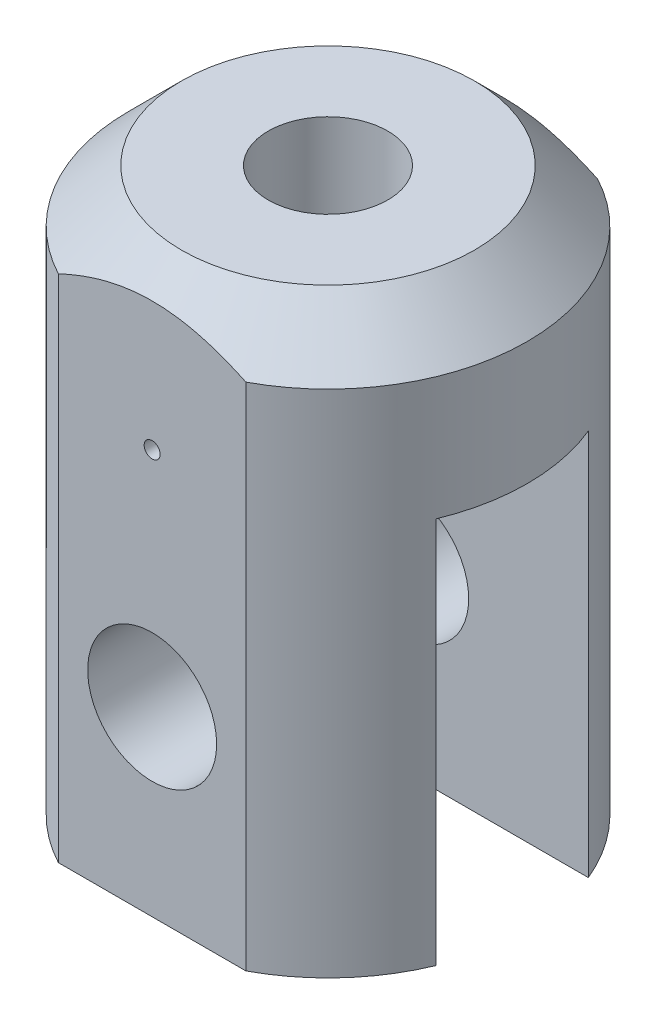
ISO-10303-21;
HEADER;
FILE_DESCRIPTION(('STEP AP214'),'2;1');
FILE_NAME('part.step','',(''),(''),'','','');
FILE_SCHEMA(('AUTOMOTIVE_DESIGN { 1 0 10303 214 1 1 1 1 }'));
ENDSEC;
DATA;
#1=APPLICATION_CONTEXT('core data for automotive mechanical design processes');
#2=APPLICATION_PROTOCOL_DEFINITION('international standard','automotive_design',2000,#1);
#3=PRODUCT_CONTEXT('',#1,'mechanical');
#4=PRODUCT('Part','Part','',(#3));
#5=PRODUCT_RELATED_PRODUCT_CATEGORY('part','',(#4));
#6=PRODUCT_DEFINITION_FORMATION('','',#4);
#7=PRODUCT_DEFINITION_CONTEXT('part definition',#1,'design');
#8=PRODUCT_DEFINITION('design','',#6,#7);
#9=PRODUCT_DEFINITION_SHAPE('','',#8);
#10=(LENGTH_UNIT() NAMED_UNIT(*) SI_UNIT(.MILLI.,.METRE.));
#11=(NAMED_UNIT(*) PLANE_ANGLE_UNIT() SI_UNIT($,.RADIAN.));
#12=(NAMED_UNIT(*) SI_UNIT($,.STERADIAN.) SOLID_ANGLE_UNIT());
#13=UNCERTAINTY_MEASURE_WITH_UNIT(LENGTH_MEASURE(1.E-05),#10,'distance_accuracy_value','');
#14=(GEOMETRIC_REPRESENTATION_CONTEXT(3) GLOBAL_UNCERTAINTY_ASSIGNED_CONTEXT((#13)) GLOBAL_UNIT_ASSIGNED_CONTEXT((#10,
#11,#12)) REPRESENTATION_CONTEXT('',''));
#15=CARTESIAN_POINT('',(0.,0.,0.));
#16=DIRECTION('',(0.,0.,1.));
#17=DIRECTION('',(1.,0.,0.));
#18=AXIS2_PLACEMENT_3D('',#15,#16,#17);
#19=CARTESIAN_POINT('',(0.,-240.,0.));
#20=DIRECTION('',(0.,1.,0.));
#21=DIRECTION('',(0.,0.,1.));
#22=AXIS2_PLACEMENT_3D('',#19,#20,#21);
#23=PLANE('',#22);
#24=CARTESIAN_POINT('',(0.,-240.,0.));
#25=DIRECTION('',(0.,1.,0.));
#26=DIRECTION('',(0.,0.,1.));
#27=AXIS2_PLACEMENT_3D('',#24,#25,#26);
#28=CIRCLE('',#27,85.);
#29=CARTESIAN_POINT('',(-78.541390362025,-240.,32.5));
#30=VERTEX_POINT('',#29);
#31=CARTESIAN_POINT('',(-40.,-240.,75.));
#32=VERTEX_POINT('',#31);
#33=EDGE_CURVE('E124',#30,#32,#28,.T.);
#34=ORIENTED_EDGE('',*,*,#33,.F.);
#35=DIRECTION('',(1.,0.,0.));
#36=VECTOR('',#35,1.);
#37=CARTESIAN_POINT('',(0.,-240.,32.5));
#38=LINE('',#37,#36);
#39=CARTESIAN_POINT('',(78.5413903620251,-240.,32.5));
#40=VERTEX_POINT('',#39);
#41=EDGE_CURVE('E43',#30,#40,#38,.T.);
#42=ORIENTED_EDGE('',*,*,#41,.T.);
#43=CARTESIAN_POINT('',(40.,-240.,75.));
#44=VERTEX_POINT('',#43);
#45=EDGE_CURVE('E121',#44,#40,#28,.T.);
#46=ORIENTED_EDGE('',*,*,#45,.F.);
#47=DIRECTION('',(1.,0.,0.));
#48=VECTOR('',#47,1.);
#49=CARTESIAN_POINT('',(-79.413150279292,-240.,75.));
#50=LINE('',#49,#48);
#51=EDGE_CURVE('E160',#32,#44,#50,.T.);
#52=ORIENTED_EDGE('',*,*,#51,.F.);
#53=EDGE_LOOP('',(#34,#42,#46,#52));
#54=FACE_BOUND('',#53,.T.);
#55=ADVANCED_FACE('F34',(#54),#23,.F.);
#56=CARTESIAN_POINT('',(0.,-240.,0.));
#57=DIRECTION('',(0.,1.,0.));
#58=DIRECTION('',(0.,0.,1.));
#59=AXIS2_PLACEMENT_3D('',#56,#57,#58);
#60=CYLINDRICAL_SURFACE('',#59,85.);
#61=DIRECTION('',(0.,1.,0.));
#62=VECTOR('',#61,1.);
#63=CARTESIAN_POINT('',(78.5413903620251,-240.,32.5));
#64=LINE('',#63,#62);
#65=CARTESIAN_POINT('',(78.5413903620251,-75.,32.5));
#66=VERTEX_POINT('',#65);
#67=EDGE_CURVE('E203',#66,#40,#64,.F.);
#68=ORIENTED_EDGE('',*,*,#67,.F.);
#69=CARTESIAN_POINT('',(0.,-75.,0.));
#70=DIRECTION('',(0.,-1.,0.));
#71=DIRECTION('',(0.,0.,-1.));
#72=AXIS2_PLACEMENT_3D('',#69,#70,#71);
#73=CIRCLE('',#72,85.);
#74=CARTESIAN_POINT('',(78.5413903620251,-75.,-32.5));
#75=VERTEX_POINT('',#74);
#76=EDGE_CURVE('E115',#66,#75,#73,.F.);
#77=ORIENTED_EDGE('',*,*,#76,.T.);
#78=DIRECTION('',(0.,1.,0.));
#79=VECTOR('',#78,1.);
#80=CARTESIAN_POINT('',(78.5413903620251,-240.,-32.5));
#81=LINE('',#80,#79);
#82=CARTESIAN_POINT('',(78.5413903620251,-240.,-32.5));
#83=VERTEX_POINT('',#82);
#84=EDGE_CURVE('E101',#83,#75,#81,.T.);
#85=ORIENTED_EDGE('',*,*,#84,.F.);
#86=CARTESIAN_POINT('',(40.,-240.,-75.));
#87=VERTEX_POINT('',#86);
#88=EDGE_CURVE('E113',#83,#87,#28,.T.);
#89=ORIENTED_EDGE('',*,*,#88,.T.);
#90=DIRECTION('',(0.,1.,0.));
#91=VECTOR('',#90,1.);
#92=CARTESIAN_POINT('',(40.,-240.,-75.));
#93=LINE('',#92,#91);
#94=CARTESIAN_POINT('',(40.,-22.5,-75.));
#95=VERTEX_POINT('',#94);
#96=EDGE_CURVE('E122',#95,#87,#93,.F.);
#97=ORIENTED_EDGE('',*,*,#96,.F.);
#98=CARTESIAN_POINT('',(0.,-22.5,0.));
#99=DIRECTION('',(0.,-1.,0.));
#100=DIRECTION('',(0.,0.,-1.));
#101=AXIS2_PLACEMENT_3D('',#98,#99,#100);
#102=CIRCLE('',#101,85.);
#103=CARTESIAN_POINT('',(40.,-22.5,75.));
#104=VERTEX_POINT('',#103);
#105=EDGE_CURVE('E202',#95,#104,#102,.T.);
#106=ORIENTED_EDGE('',*,*,#105,.T.);
#107=DIRECTION('',(0.,1.,0.));
#108=VECTOR('',#107,1.);
#109=CARTESIAN_POINT('',(40.,-240.,75.));
#110=LINE('',#109,#108);
#111=EDGE_CURVE('E196',#104,#44,#110,.F.);
#112=ORIENTED_EDGE('',*,*,#111,.T.);
#113=ORIENTED_EDGE('',*,*,#45,.T.);
#114=EDGE_LOOP('',(#68,#77,#85,#89,#97,#106,#112,#113));
#115=FACE_BOUND('',#114,.T.);
#116=ADVANCED_FACE('F36',(#115),#60,.T.);
#117=DIRECTION('',(0.,1.,0.));
#118=VECTOR('',#117,1.);
#119=CARTESIAN_POINT('',(-78.5413903620251,-240.,32.5));
#120=LINE('',#119,#118);
#121=CARTESIAN_POINT('',(-78.5413903620251,-75.,32.5));
#122=VERTEX_POINT('',#121);
#123=EDGE_CURVE('E116',#30,#122,#120,.T.);
#124=ORIENTED_EDGE('',*,*,#123,.F.);
#125=ORIENTED_EDGE('',*,*,#33,.T.);
#126=DIRECTION('',(0.,1.,0.));
#127=VECTOR('',#126,1.);
#128=CARTESIAN_POINT('',(-40.,-240.,75.));
#129=LINE('',#128,#127);
#130=CARTESIAN_POINT('',(-40.,-22.5,75.));
#131=VERTEX_POINT('',#130);
#132=EDGE_CURVE('E193',#32,#131,#129,.T.);
#133=ORIENTED_EDGE('',*,*,#132,.T.);
#134=CARTESIAN_POINT('',(-40.,-22.5,-75.));
#135=VERTEX_POINT('',#134);
#136=EDGE_CURVE('E58',#131,#135,#102,.T.);
#137=ORIENTED_EDGE('',*,*,#136,.T.);
#138=DIRECTION('',(0.,1.,0.));
#139=VECTOR('',#138,1.);
#140=CARTESIAN_POINT('',(-40.,-240.,-75.));
#141=LINE('',#140,#139);
#142=CARTESIAN_POINT('',(-40.,-240.,-75.));
#143=VERTEX_POINT('',#142);
#144=EDGE_CURVE('E127',#143,#135,#141,.T.);
#145=ORIENTED_EDGE('',*,*,#144,.F.);
#146=CARTESIAN_POINT('',(-78.5413903620251,-240.,-32.5));
#147=VERTEX_POINT('',#146);
#148=EDGE_CURVE('E125',#143,#147,#28,.T.);
#149=ORIENTED_EDGE('',*,*,#148,.T.);
#150=DIRECTION('',(0.,1.,0.));
#151=VECTOR('',#150,1.);
#152=CARTESIAN_POINT('',(-78.5413903620251,-240.,-32.5));
#153=LINE('',#152,#151);
#154=CARTESIAN_POINT('',(-78.5413903620251,-75.,-32.5));
#155=VERTEX_POINT('',#154);
#156=EDGE_CURVE('E50',#155,#147,#153,.F.);
#157=ORIENTED_EDGE('',*,*,#156,.F.);
#158=CARTESIAN_POINT('',(0.,-75.,0.));
#159=DIRECTION('',(0.,-1.,0.));
#160=DIRECTION('',(0.,0.,-1.));
#161=AXIS2_PLACEMENT_3D('',#158,#159,#160);
#162=CIRCLE('',#161,85.);
#163=EDGE_CURVE('E11',#155,#122,#162,.F.);
#164=ORIENTED_EDGE('',*,*,#163,.T.);
#165=EDGE_LOOP('',(#124,#125,#133,#137,#145,#149,#157,#164));
#166=FACE_BOUND('',#165,.T.);
#167=ADVANCED_FACE('F170',(#166),#60,.T.);
#168=ORIENTED_EDGE('',*,*,#88,.F.);
#169=DIRECTION('',(-1.,0.,0.));
#170=VECTOR('',#169,1.);
#171=CARTESIAN_POINT('',(0.,-240.,-32.5));
#172=LINE('',#171,#170);
#173=EDGE_CURVE('E98',#83,#147,#172,.T.);
#174=ORIENTED_EDGE('',*,*,#173,.T.);
#175=ORIENTED_EDGE('',*,*,#148,.F.);
#176=DIRECTION('',(1.,0.,0.));
#177=VECTOR('',#176,1.);
#178=CARTESIAN_POINT('',(-79.413150279292,-240.,-75.));
#179=LINE('',#178,#177);
#180=EDGE_CURVE('E120',#143,#87,#179,.T.);
#181=ORIENTED_EDGE('',*,*,#180,.T.);
#182=EDGE_LOOP('',(#168,#174,#175,#181));
#183=FACE_BOUND('',#182,.T.);
#184=ADVANCED_FACE('F119',(#183),#23,.F.);
#185=CARTESIAN_POINT('',(-79.413150279292,-240.,-75.));
#186=DIRECTION('',(0.,0.,1.));
#187=DIRECTION('',(1.,0.,0.));
#188=AXIS2_PLACEMENT_3D('',#185,#186,#187);
#189=PLANE('',#188);
#190=CARTESIAN_POINT('',(0.,-162.5,-75.));
#191=DIRECTION('',(0.,0.,1.));
#192=DIRECTION('',(1.,0.,0.));
#193=AXIS2_PLACEMENT_3D('',#190,#191,#192);
#194=CIRCLE('',#193,27.5);
#195=CARTESIAN_POINT('',(27.5,-162.5,-75.));
#196=VERTEX_POINT('',#195);
#197=EDGE_CURVE('E220',#196,#196,#194,.T.);
#198=ORIENTED_EDGE('',*,*,#197,.T.);
#199=EDGE_LOOP('',(#198));
#200=FACE_BOUND('',#199,.T.);
#201=ORIENTED_EDGE('',*,*,#144,.T.);
#202=CARTESIAN_POINT('',(-80.0965565096228,-47.229022435722,-75.));
#203=CARTESIAN_POINT('',(-79.1076807722083,-46.5072125290357,-75.));
#204=CARTESIAN_POINT('',(-78.1158416018095,-45.7894481177992,-75.));
#205=CARTESIAN_POINT('',(-76.1257846585171,-44.3627753691444,-75.));
#206=CARTESIAN_POINT('',(-75.127566753531,-43.6538672160278,-75.));
#207=CARTESIAN_POINT('',(-73.1240710175857,-42.2455118772379,-75.));
#208=CARTESIAN_POINT('',(-72.1187913518815,-41.5460672997208,-75.));
#209=CARTESIAN_POINT('',(-70.1009726581121,-40.1577335242058,-75.));
#210=CARTESIAN_POINT('',(-69.0884336651553,-39.4688442752096,-75.));
#211=CARTESIAN_POINT('',(-67.0477730628265,-38.0973590972641,-75.));
#212=CARTESIAN_POINT('',(-66.019591500738,-37.4148523081759,-75.));
#213=CARTESIAN_POINT('',(-63.9548011707982,-36.0627100265484,-75.));
#214=CARTESIAN_POINT('',(-62.9181924490843,-35.3930744636084,-75.));
#215=CARTESIAN_POINT('',(-60.8360191349141,-34.0679881792657,-75.));
#216=CARTESIAN_POINT('',(-59.7904550317895,-33.4125366896449,-75.));
#217=CARTESIAN_POINT('',(-57.6897259572525,-32.1172324416316,-75.));
#218=CARTESIAN_POINT('',(-56.6345611569549,-31.4773794059701,-75.));
#219=CARTESIAN_POINT('',(-54.4634591626763,-30.1847979775503,-75.));
#220=CARTESIAN_POINT('',(-53.3470217279639,-29.532908618892,-75.));
#221=CARTESIAN_POINT('',(-51.1021438875075,-28.2500998850919,-75.));
#222=CARTESIAN_POINT('',(-49.9737034446527,-27.6191805748103,-75.));
#223=CARTESIAN_POINT('',(-47.7038845577264,-26.3805713741219,-75.));
#224=CARTESIAN_POINT('',(-46.5625040365004,-25.7728852835957,-75.));
#225=CARTESIAN_POINT('',(-44.2662691495148,-24.5835119150129,-75.));
#226=CARTESIAN_POINT('',(-43.1114148664573,-24.0018244774821,-75.));
#227=CARTESIAN_POINT('',(-40.7909699944915,-22.8690868947769,-75.));
#228=CARTESIAN_POINT('',(-39.6254215159099,-22.3179508312541,-75.));
#229=CARTESIAN_POINT('',(-37.2797239529272,-21.2477675090494,-75.));
#230=CARTESIAN_POINT('',(-36.0995745331904,-20.7287209890068,-75.));
#231=CARTESIAN_POINT('',(-32.5372440993667,-19.2253778409192,-75.));
#232=CARTESIAN_POINT('',(-30.1319723460605,-18.2942798359704,-75.));
#233=CARTESIAN_POINT('',(-26.5326965036466,-17.0474215584432,-75.));
#234=CARTESIAN_POINT('',(-25.3617932176856,-16.6641600323161,-75.));
#235=CARTESIAN_POINT('',(-23.0065261873304,-15.9413421624267,-75.));
#236=CARTESIAN_POINT('',(-21.8221629965068,-15.601784028287,-75.));
#237=CARTESIAN_POINT('',(-19.4406287562146,-14.9701221220316,-75.));
#238=CARTESIAN_POINT('',(-18.2434558219938,-14.6780254383693,-75.));
#239=CARTESIAN_POINT('',(-15.8377154313343,-14.1450100082106,-75.));
#240=CARTESIAN_POINT('',(-14.6291479353236,-13.9040914395181,-75.));
#241=CARTESIAN_POINT('',(-12.2219744240377,-13.4802331998045,-75.));
#242=CARTESIAN_POINT('',(-11.0235227663873,-13.296419982498,-75.));
#243=CARTESIAN_POINT('',(-8.61939347775355,-12.9842600747091,-75.));
#244=CARTESIAN_POINT('',(-7.4137159039305,-12.8559129460501,-75.));
#245=CARTESIAN_POINT('',(-4.99771438196127,-12.6566898539133,-75.));
#246=CARTESIAN_POINT('',(-3.78739087724627,-12.585808536225,-75.));
#247=CARTESIAN_POINT('',(-1.36472629655294,-12.5026464207488,-75.));
#248=CARTESIAN_POINT('',(-0.152385231290293,-12.4903653127104,-75.));
#249=CARTESIAN_POINT('',(2.23929723653598,-12.5241479001043,-75.));
#250=CARTESIAN_POINT('',(3.41866076502099,-12.5686722415345,-75.));
#251=CARTESIAN_POINT('',(5.77400270416698,-12.7127473074503,-75.));
#252=CARTESIAN_POINT('',(6.94998113468906,-12.8122977084218,-75.));
#253=CARTESIAN_POINT('',(9.29623363832083,-13.0649354792961,-75.));
#254=CARTESIAN_POINT('',(10.4665072946855,-13.2180267027525,-75.));
#255=CARTESIAN_POINT('',(12.799163774649,-13.5755550136784,-75.));
#256=CARTESIAN_POINT('',(13.961546518016,-13.7799926224185,-75.));
#257=CARTESIAN_POINT('',(16.2957395630622,-14.2412575610105,-75.));
#258=CARTESIAN_POINT('',(17.4673897506705,-14.4988924153789,-75.));
#259=CARTESIAN_POINT('',(19.7993698895876,-15.0611650835287,-75.));
#260=CARTESIAN_POINT('',(20.9596993215639,-15.3658050429608,-75.));
#261=CARTESIAN_POINT('',(23.2677610257618,-16.0185555842206,-75.));
#262=CARTESIAN_POINT('',(24.4154959128499,-16.3666569494843,-75.));
#263=CARTESIAN_POINT('',(26.6980565459663,-17.1028834832079,-75.));
#264=CARTESIAN_POINT('',(27.8328818178536,-17.4910101164695,-75.));
#265=CARTESIAN_POINT('',(30.2703245777213,-18.3690348010723,-75.));
#266=CARTESIAN_POINT('',(31.5706569391307,-18.8652709683034,-75.));
#267=CARTESIAN_POINT('',(34.1536230675079,-19.901883804468,-75.));
#268=CARTESIAN_POINT('',(35.4362558018278,-20.4422630362158,-75.));
#269=CARTESIAN_POINT('',(37.9847150772235,-21.5626439704675,-75.));
#270=CARTESIAN_POINT('',(39.2505340991413,-22.1426627316753,-75.));
#271=CARTESIAN_POINT('',(41.7654151659826,-23.3377878640705,-75.));
#272=CARTESIAN_POINT('',(43.0144776470402,-23.9528933198349,-75.));
#273=CARTESIAN_POINT('',(45.5008282668364,-25.2164477488109,-75.));
#274=CARTESIAN_POINT('',(46.7380632945557,-25.8650010103738,-75.));
#275=CARTESIAN_POINT('',(49.1974325903362,-27.1901010526647,-75.));
#276=CARTESIAN_POINT('',(50.4195667565195,-27.8666480221184,-75.));
#277=CARTESIAN_POINT('',(52.849436185799,-29.2445459456981,-75.));
#278=CARTESIAN_POINT('',(54.0571741831919,-29.9458920859573,-75.));
#279=CARTESIAN_POINT('',(56.4594320625127,-31.3708281945021,-75.));
#280=CARTESIAN_POINT('',(57.6539519904487,-32.0944180853308,-75.));
#281=CARTESIAN_POINT('',(59.9702131535944,-33.5241590567459,-75.));
#282=CARTESIAN_POINT('',(61.0925643439999,-34.2293234273248,-75.));
#283=CARTESIAN_POINT('',(63.3269420362696,-35.6558057331871,-75.));
#284=CARTESIAN_POINT('',(64.4389685554248,-36.3771236414106,-75.));
#285=CARTESIAN_POINT('',(66.6534850109892,-37.8344005767177,-75.));
#286=CARTESIAN_POINT('',(67.7559743002458,-38.5703605863378,-75.));
#287=CARTESIAN_POINT('',(69.9520156325945,-40.0554985066143,-75.));
#288=CARTESIAN_POINT('',(71.0455676278582,-40.8046764879396,-75.));
#289=CARTESIAN_POINT('',(73.2152838426318,-42.3087378422102,-75.));
#290=CARTESIAN_POINT('',(74.291517026343,-43.0635218015686,-75.));
#291=CARTESIAN_POINT('',(76.4363727176249,-44.5838312190338,-75.));
#292=CARTESIAN_POINT('',(77.5049951907664,-45.3493567256867,-75.));
#293=CARTESIAN_POINT('',(79.6348647685629,-46.8899941943608,-75.));
#294=CARTESIAN_POINT('',(80.6961137777878,-47.6651035252859,-75.));
#295=CARTESIAN_POINT('',(82.8119821373575,-49.2242775404491,-75.));
#296=CARTESIAN_POINT('',(83.866601617859,-50.0083420480148,-75.));
#297=CARTESIAN_POINT('',(84.918155080723,-50.7964830094638,-75.));
#298=B_SPLINE_CURVE_WITH_KNOTS('',3,(#202,#203,#204,#205,#206,#207,#208,#209,#210,#211,#212,
#213,#214,#215,#216,#217,#218,#219,#220,#221,#222,#223,#224,#225,#226,#227,#228,#229,#230,#231,
#232,#233,#234,#235,#236,#237,#238,#239,#240,#241,#242,#243,#244,#245,#246,#247,#248,#249,#250,
#251,#252,#253,#254,#255,#256,#257,#258,#259,#260,#261,#262,#263,#264,#265,#266,#267,#268,#269,
#270,#271,#272,#273,#274,#275,#276,#277,#278,#279,#280,#281,#282,#283,#284,#285,#286,#287,#288,
#289,#290,#291,#292,#293,#294,#295,#296,#297),.UNSPECIFIED.,.F.,.F.,(4,2,2,2,2,2,2,2,2,2,2,2,2,
2,2,2,2,2,2,2,2,2,2,2,2,2,2,2,2,2,2,2,2,2,2,2,2,2,2,2,2,2,2,2,2,2,2,4),(0.,3.67287076928323,
7.34581784536401,11.0197573692277,14.6936791367653,18.3958546693109,22.0980099466359,
25.7999642086057,29.5018526187564,33.3801163206349,37.2583920168109,41.1372993294868,
45.0161828459232,48.8835380015946,52.7509821431988,60.4818307405035,64.1772688242699,
67.872555470448,71.5683935080921,75.2642443856777,78.9004054992979,82.5365378870904,
86.172331449833,89.8081057633512,93.3474160325458,96.8867054933374,100.426249743815,
103.965829929346,107.563716438858,111.161767230375,114.759056299682,118.35647706547,
122.530961363743,126.705688192554,130.88222305011,135.058648990346,139.248993179601,
143.439365623569,147.62892907536,151.818477939938,155.794803991539,159.771123382651,
163.747710504788,167.724318893886,171.667823340831,175.611345616096,179.553808288644,
183.496193316058),.UNSPECIFIED.);
#299=EDGE_CURVE('E152',#135,#95,#298,.T.);
#300=ORIENTED_EDGE('',*,*,#299,.T.);
#301=ORIENTED_EDGE('',*,*,#96,.T.);
#302=ORIENTED_EDGE('',*,*,#180,.F.);
#303=EDGE_LOOP('',(#201,#300,#301,#302));
#304=FACE_BOUND('',#303,.T.);
#305=ADVANCED_FACE('F164',(#200,#304),#189,.F.);
#306=CARTESIAN_POINT('',(-79.413150279292,-240.,75.));
#307=DIRECTION('',(0.,0.,1.));
#308=DIRECTION('',(1.,0.,0.));
#309=AXIS2_PLACEMENT_3D('',#306,#307,#308);
#310=PLANE('',#309);
#311=CARTESIAN_POINT('',(0.,-67.5,75.));
#312=DIRECTION('',(0.,0.,1.));
#313=DIRECTION('',(1.,0.,0.));
#314=AXIS2_PLACEMENT_3D('',#311,#312,#313);
#315=CIRCLE('',#314,3.4);
#316=CARTESIAN_POINT('',(3.40000000000001,-67.5,75.));
#317=VERTEX_POINT('',#316);
#318=EDGE_CURVE('E224',#317,#317,#315,.T.);
#319=ORIENTED_EDGE('',*,*,#318,.F.);
#320=EDGE_LOOP('',(#319));
#321=FACE_BOUND('',#320,.T.);
#322=CARTESIAN_POINT('',(0.,-162.5,75.));
#323=DIRECTION('',(0.,0.,1.));
#324=DIRECTION('',(1.,0.,0.));
#325=AXIS2_PLACEMENT_3D('',#322,#323,#324);
#326=CIRCLE('',#325,27.5);
#327=CARTESIAN_POINT('',(27.5,-162.5,75.));
#328=VERTEX_POINT('',#327);
#329=EDGE_CURVE('E217',#328,#328,#326,.T.);
#330=ORIENTED_EDGE('',*,*,#329,.F.);
#331=EDGE_LOOP('',(#330));
#332=FACE_BOUND('',#331,.T.);
#333=CARTESIAN_POINT('',(-80.0965565096228,-47.229022435722,75.));
#334=CARTESIAN_POINT('',(-79.1076807722083,-46.5072125290357,75.));
#335=CARTESIAN_POINT('',(-78.1158416018095,-45.7894481177992,75.));
#336=CARTESIAN_POINT('',(-76.1257846585171,-44.3627753691444,75.));
#337=CARTESIAN_POINT('',(-75.127566753531,-43.6538672160278,75.));
#338=CARTESIAN_POINT('',(-73.1240710175857,-42.2455118772379,75.));
#339=CARTESIAN_POINT('',(-72.1187913518815,-41.5460672997208,75.));
#340=CARTESIAN_POINT('',(-70.1009726581121,-40.1577335242058,75.));
#341=CARTESIAN_POINT('',(-69.0884336651553,-39.4688442752096,75.));
#342=CARTESIAN_POINT('',(-67.0477730628265,-38.0973590972641,75.));
#343=CARTESIAN_POINT('',(-66.019591500738,-37.4148523081759,75.));
#344=CARTESIAN_POINT('',(-63.9548011707982,-36.0627100265484,75.));
#345=CARTESIAN_POINT('',(-62.9181924490843,-35.3930744636084,75.));
#346=CARTESIAN_POINT('',(-60.8360191349141,-34.0679881792657,75.));
#347=CARTESIAN_POINT('',(-59.7904550317895,-33.4125366896449,75.));
#348=CARTESIAN_POINT('',(-57.6897259572525,-32.1172324416316,75.));
#349=CARTESIAN_POINT('',(-56.6345611569549,-31.4773794059701,75.));
#350=CARTESIAN_POINT('',(-54.4634591626763,-30.1847979775503,75.));
#351=CARTESIAN_POINT('',(-53.3470217279639,-29.532908618892,75.));
#352=CARTESIAN_POINT('',(-51.1021438875075,-28.2500998850919,75.));
#353=CARTESIAN_POINT('',(-49.9737034446527,-27.6191805748103,75.));
#354=CARTESIAN_POINT('',(-47.7038845577264,-26.3805713741219,75.));
#355=CARTESIAN_POINT('',(-46.5625040365004,-25.7728852835957,75.));
#356=CARTESIAN_POINT('',(-44.2662691495148,-24.5835119150129,75.));
#357=CARTESIAN_POINT('',(-43.1114148664573,-24.0018244774821,75.));
#358=CARTESIAN_POINT('',(-40.7909699944915,-22.8690868947769,75.));
#359=CARTESIAN_POINT('',(-39.6254215159099,-22.3179508312541,75.));
#360=CARTESIAN_POINT('',(-37.2797239529272,-21.2477675090494,75.));
#361=CARTESIAN_POINT('',(-36.0995745331904,-20.7287209890068,75.));
#362=CARTESIAN_POINT('',(-32.5372440993667,-19.2253778409192,75.));
#363=CARTESIAN_POINT('',(-30.1319723460605,-18.2942798359704,75.));
#364=CARTESIAN_POINT('',(-26.5326965036466,-17.0474215584432,75.));
#365=CARTESIAN_POINT('',(-25.3617932176856,-16.6641600323161,75.));
#366=CARTESIAN_POINT('',(-23.0065261873304,-15.9413421624267,75.));
#367=CARTESIAN_POINT('',(-21.8221629965068,-15.601784028287,75.));
#368=CARTESIAN_POINT('',(-19.4406287562146,-14.9701221220316,75.));
#369=CARTESIAN_POINT('',(-18.2434558219938,-14.6780254383693,75.));
#370=CARTESIAN_POINT('',(-15.8377154313343,-14.1450100082106,75.));
#371=CARTESIAN_POINT('',(-14.6291479353236,-13.9040914395181,75.));
#372=CARTESIAN_POINT('',(-12.2219744240377,-13.4802331998045,75.));
#373=CARTESIAN_POINT('',(-11.0235227663873,-13.296419982498,75.));
#374=CARTESIAN_POINT('',(-8.61939347775355,-12.9842600747091,75.));
#375=CARTESIAN_POINT('',(-7.4137159039305,-12.8559129460501,75.));
#376=CARTESIAN_POINT('',(-4.99771438196127,-12.6566898539133,75.));
#377=CARTESIAN_POINT('',(-3.78739087724627,-12.585808536225,75.));
#378=CARTESIAN_POINT('',(-1.36472629655294,-12.5026464207488,75.));
#379=CARTESIAN_POINT('',(-0.152385231290293,-12.4903653127104,75.));
#380=CARTESIAN_POINT('',(2.23929723653598,-12.5241479001043,75.));
#381=CARTESIAN_POINT('',(3.41866076502099,-12.5686722415345,75.));
#382=CARTESIAN_POINT('',(5.77400270416698,-12.7127473074503,75.));
#383=CARTESIAN_POINT('',(6.94998113468906,-12.8122977084218,75.));
#384=CARTESIAN_POINT('',(9.29623363832083,-13.0649354792961,75.));
#385=CARTESIAN_POINT('',(10.4665072946855,-13.2180267027525,75.));
#386=CARTESIAN_POINT('',(12.799163774649,-13.5755550136784,75.));
#387=CARTESIAN_POINT('',(13.961546518016,-13.7799926224185,75.));
#388=CARTESIAN_POINT('',(16.2957395630622,-14.2412575610105,75.));
#389=CARTESIAN_POINT('',(17.4673897506705,-14.4988924153789,75.));
#390=CARTESIAN_POINT('',(19.7993698895876,-15.0611650835287,75.));
#391=CARTESIAN_POINT('',(20.9596993215639,-15.3658050429608,75.));
#392=CARTESIAN_POINT('',(23.2677610257618,-16.0185555842206,75.));
#393=CARTESIAN_POINT('',(24.4154959128499,-16.3666569494843,75.));
#394=CARTESIAN_POINT('',(26.6980565459663,-17.1028834832079,75.));
#395=CARTESIAN_POINT('',(27.8328818178536,-17.4910101164695,75.));
#396=CARTESIAN_POINT('',(30.2703245777213,-18.3690348010723,75.));
#397=CARTESIAN_POINT('',(31.5706569391307,-18.8652709683034,75.));
#398=CARTESIAN_POINT('',(34.1536230675079,-19.901883804468,75.));
#399=CARTESIAN_POINT('',(35.4362558018278,-20.4422630362158,75.));
#400=CARTESIAN_POINT('',(37.9847150772235,-21.5626439704675,75.));
#401=CARTESIAN_POINT('',(39.2505340991413,-22.1426627316753,75.));
#402=CARTESIAN_POINT('',(41.7654151659826,-23.3377878640705,75.));
#403=CARTESIAN_POINT('',(43.0144776470402,-23.9528933198349,75.));
#404=CARTESIAN_POINT('',(45.5008282668364,-25.2164477488109,75.));
#405=CARTESIAN_POINT('',(46.7380632945557,-25.8650010103738,75.));
#406=CARTESIAN_POINT('',(49.1974325903362,-27.1901010526647,75.));
#407=CARTESIAN_POINT('',(50.4195667565195,-27.8666480221184,75.));
#408=CARTESIAN_POINT('',(52.849436185799,-29.2445459456981,75.));
#409=CARTESIAN_POINT('',(54.0571741831919,-29.9458920859573,75.));
#410=CARTESIAN_POINT('',(56.4594320625127,-31.3708281945021,75.));
#411=CARTESIAN_POINT('',(57.6539519904487,-32.0944180853308,75.));
#412=CARTESIAN_POINT('',(59.9702131535944,-33.5241590567459,75.));
#413=CARTESIAN_POINT('',(61.0925643439999,-34.2293234273248,75.));
#414=CARTESIAN_POINT('',(63.3269420362696,-35.6558057331871,75.));
#415=CARTESIAN_POINT('',(64.4389685554248,-36.3771236414106,75.));
#416=CARTESIAN_POINT('',(66.6534850109892,-37.8344005767177,75.));
#417=CARTESIAN_POINT('',(67.7559743002458,-38.5703605863378,75.));
#418=CARTESIAN_POINT('',(69.9520156325945,-40.0554985066143,75.));
#419=CARTESIAN_POINT('',(71.0455676278582,-40.8046764879396,75.));
#420=CARTESIAN_POINT('',(73.2152838426318,-42.3087378422102,75.));
#421=CARTESIAN_POINT('',(74.291517026343,-43.0635218015686,75.));
#422=CARTESIAN_POINT('',(76.4363727176249,-44.5838312190338,75.));
#423=CARTESIAN_POINT('',(77.5049951907664,-45.3493567256867,75.));
#424=CARTESIAN_POINT('',(79.6348647685629,-46.8899941943608,75.));
#425=CARTESIAN_POINT('',(80.6961137777878,-47.6651035252859,75.));
#426=CARTESIAN_POINT('',(82.8119821373575,-49.2242775404491,75.));
#427=CARTESIAN_POINT('',(83.866601617859,-50.0083420480148,75.));
#428=CARTESIAN_POINT('',(84.918155080723,-50.7964830094638,75.));
#429=B_SPLINE_CURVE_WITH_KNOTS('',3,(#333,#334,#335,#336,#337,#338,#339,#340,#341,#342,#343,
#344,#345,#346,#347,#348,#349,#350,#351,#352,#353,#354,#355,#356,#357,#358,#359,#360,#361,#362,
#363,#364,#365,#366,#367,#368,#369,#370,#371,#372,#373,#374,#375,#376,#377,#378,#379,#380,#381,
#382,#383,#384,#385,#386,#387,#388,#389,#390,#391,#392,#393,#394,#395,#396,#397,#398,#399,#400,
#401,#402,#403,#404,#405,#406,#407,#408,#409,#410,#411,#412,#413,#414,#415,#416,#417,#418,#419,
#420,#421,#422,#423,#424,#425,#426,#427,#428),.UNSPECIFIED.,.F.,.F.,(4,2,2,2,2,2,2,2,2,2,2,2,2,
2,2,2,2,2,2,2,2,2,2,2,2,2,2,2,2,2,2,2,2,2,2,2,2,2,2,2,2,2,2,2,2,2,2,4),(0.,3.67287076928323,
7.34581784536401,11.0197573692277,14.6936791367653,18.3958546693109,22.0980099466359,
25.7999642086057,29.5018526187564,33.3801163206349,37.2583920168109,41.1372993294868,
45.0161828459232,48.8835380015946,52.7509821431988,60.4818307405035,64.1772688242699,
67.872555470448,71.5683935080921,75.2642443856777,78.9004054992979,82.5365378870904,
86.172331449833,89.8081057633512,93.3474160325458,96.8867054933374,100.426249743815,
103.965829929346,107.563716438858,111.161767230375,114.759056299682,118.35647706547,
122.530961363743,126.705688192554,130.88222305011,135.058648990346,139.248993179601,
143.439365623569,147.62892907536,151.818477939938,155.794803991539,159.771123382651,
163.747710504788,167.724318893886,171.667823340831,175.611345616096,179.553808288644,
183.496193316058),.UNSPECIFIED.);
#430=EDGE_CURVE('E107',#131,#104,#429,.T.);
#431=ORIENTED_EDGE('',*,*,#430,.F.);
#432=ORIENTED_EDGE('',*,*,#132,.F.);
#433=ORIENTED_EDGE('',*,*,#51,.T.);
#434=ORIENTED_EDGE('',*,*,#111,.F.);
#435=EDGE_LOOP('',(#431,#432,#433,#434));
#436=FACE_BOUND('',#435,.T.);
#437=ADVANCED_FACE('F140',(#321,#332,#436),#310,.T.);
#438=CARTESIAN_POINT('',(0.,0.,0.));
#439=DIRECTION('',(0.,-1.,0.));
#440=DIRECTION('',(0.,0.,-1.));
#441=AXIS2_PLACEMENT_3D('',#438,#439,#440);
#442=CONICAL_SURFACE('',#441,62.5,0.785398163397449);
#443=CARTESIAN_POINT('',(0.,0.,0.));
#444=DIRECTION('',(0.,-1.,0.));
#445=DIRECTION('',(0.,0.,-1.));
#446=AXIS2_PLACEMENT_3D('',#443,#444,#445);
#447=CIRCLE('',#446,62.5);
#448=CARTESIAN_POINT('',(0.,0.,-62.5));
#449=VERTEX_POINT('',#448);
#450=EDGE_CURVE('E161',#449,#449,#447,.T.);
#451=ORIENTED_EDGE('',*,*,#450,.T.);
#452=EDGE_LOOP('',(#451));
#453=FACE_BOUND('',#452,.T.);
#454=ORIENTED_EDGE('',*,*,#136,.F.);
#455=ORIENTED_EDGE('',*,*,#430,.T.);
#456=ORIENTED_EDGE('',*,*,#105,.F.);
#457=ORIENTED_EDGE('',*,*,#299,.F.);
#458=EDGE_LOOP('',(#454,#455,#456,#457));
#459=FACE_BOUND('',#458,.T.);
#460=ADVANCED_FACE('F143',(#453,#459),#442,.T.);
#461=CARTESIAN_POINT('',(0.,0.,0.));
#462=DIRECTION('',(0.,1.,0.));
#463=DIRECTION('',(0.,0.,1.));
#464=AXIS2_PLACEMENT_3D('',#461,#462,#463);
#465=PLANE('',#464);
#466=CARTESIAN_POINT('',(0.,0.,0.));
#467=DIRECTION('',(0.,1.,0.));
#468=DIRECTION('',(0.,0.,1.));
#469=AXIS2_PLACEMENT_3D('',#466,#467,#468);
#470=CIRCLE('',#469,25.5);
#471=CARTESIAN_POINT('',(0.,0.,25.5));
#472=VERTEX_POINT('',#471);
#473=EDGE_CURVE('E227',#472,#472,#470,.T.);
#474=ORIENTED_EDGE('',*,*,#473,.F.);
#475=EDGE_LOOP('',(#474));
#476=FACE_BOUND('',#475,.T.);
#477=ORIENTED_EDGE('',*,*,#450,.F.);
#478=EDGE_LOOP('',(#477));
#479=FACE_BOUND('',#478,.T.);
#480=ADVANCED_FACE('F147',(#476,#479),#465,.T.);
#481=CARTESIAN_POINT('',(94.,-75.,32.5));
#482=DIRECTION('',(0.,0.,1.));
#483=DIRECTION('',(1.,0.,0.));
#484=AXIS2_PLACEMENT_3D('',#481,#482,#483);
#485=PLANE('',#484);
#486=CARTESIAN_POINT('',(0.,-162.5,32.5));
#487=DIRECTION('',(0.,0.,1.));
#488=DIRECTION('',(1.,0.,0.));
#489=AXIS2_PLACEMENT_3D('',#486,#487,#488);
#490=CIRCLE('',#489,27.5);
#491=CARTESIAN_POINT('',(27.5,-162.5,32.5));
#492=VERTEX_POINT('',#491);
#493=EDGE_CURVE('E214',#492,#492,#490,.T.);
#494=ORIENTED_EDGE('',*,*,#493,.T.);
#495=EDGE_LOOP('',(#494));
#496=FACE_BOUND('',#495,.T.);
#497=ORIENTED_EDGE('',*,*,#67,.T.);
#498=ORIENTED_EDGE('',*,*,#41,.F.);
#499=ORIENTED_EDGE('',*,*,#123,.T.);
#500=DIRECTION('',(-1.,0.,0.));
#501=VECTOR('',#500,1.);
#502=CARTESIAN_POINT('',(94.,-75.,32.5));
#503=LINE('',#502,#501);
#504=EDGE_CURVE('E209',#66,#122,#503,.T.);
#505=ORIENTED_EDGE('',*,*,#504,.F.);
#506=EDGE_LOOP('',(#497,#498,#499,#505));
#507=FACE_BOUND('',#506,.T.);
#508=ADVANCED_FACE('F172',(#496,#507),#485,.F.);
#509=CARTESIAN_POINT('',(94.,-75.,-32.5));
#510=DIRECTION('',(0.,0.,-1.));
#511=DIRECTION('',(-1.,0.,0.));
#512=AXIS2_PLACEMENT_3D('',#509,#510,#511);
#513=PLANE('',#512);
#514=CARTESIAN_POINT('',(0.,-162.5,-32.5));
#515=DIRECTION('',(0.,0.,-1.));
#516=DIRECTION('',(-1.,0.,0.));
#517=AXIS2_PLACEMENT_3D('',#514,#515,#516);
#518=CIRCLE('',#517,27.5);
#519=CARTESIAN_POINT('',(-27.5,-162.5,-32.5));
#520=VERTEX_POINT('',#519);
#521=EDGE_CURVE('E38',#520,#520,#518,.T.);
#522=ORIENTED_EDGE('',*,*,#521,.T.);
#523=EDGE_LOOP('',(#522));
#524=FACE_BOUND('',#523,.T.);
#525=ORIENTED_EDGE('',*,*,#84,.T.);
#526=DIRECTION('',(1.,0.,0.));
#527=VECTOR('',#526,1.);
#528=CARTESIAN_POINT('',(94.,-75.,-32.5));
#529=LINE('',#528,#527);
#530=EDGE_CURVE('E212',#155,#75,#529,.T.);
#531=ORIENTED_EDGE('',*,*,#530,.F.);
#532=ORIENTED_EDGE('',*,*,#156,.T.);
#533=ORIENTED_EDGE('',*,*,#173,.F.);
#534=EDGE_LOOP('',(#525,#531,#532,#533));
#535=FACE_BOUND('',#534,.T.);
#536=ADVANCED_FACE('F100',(#524,#535),#513,.F.);
#537=CARTESIAN_POINT('',(0.,-75.,0.));
#538=DIRECTION('',(0.,-1.,0.));
#539=DIRECTION('',(0.,0.,-1.));
#540=AXIS2_PLACEMENT_3D('',#537,#538,#539);
#541=PLANE('',#540);
#542=CARTESIAN_POINT('',(0.,-75.,0.));
#543=DIRECTION('',(0.,-1.,0.));
#544=DIRECTION('',(0.,0.,-1.));
#545=AXIS2_PLACEMENT_3D('',#542,#543,#544);
#546=CIRCLE('',#545,25.5);
#547=CARTESIAN_POINT('',(0.,-75.,-25.5));
#548=VERTEX_POINT('',#547);
#549=EDGE_CURVE('E230',#548,#548,#546,.F.);
#550=ORIENTED_EDGE('',*,*,#549,.T.);
#551=EDGE_LOOP('',(#550));
#552=FACE_BOUND('',#551,.T.);
#553=ORIENTED_EDGE('',*,*,#504,.T.);
#554=ORIENTED_EDGE('',*,*,#163,.F.);
#555=ORIENTED_EDGE('',*,*,#530,.T.);
#556=ORIENTED_EDGE('',*,*,#76,.F.);
#557=EDGE_LOOP('',(#553,#554,#555,#556));
#558=FACE_BOUND('',#557,.T.);
#559=ADVANCED_FACE('F256',(#552,#558),#541,.T.);
#560=CARTESIAN_POINT('',(0.,-162.5,-75.));
#561=DIRECTION('',(0.,0.,1.));
#562=DIRECTION('',(1.,0.,0.));
#563=AXIS2_PLACEMENT_3D('',#560,#561,#562);
#564=CYLINDRICAL_SURFACE('',#563,27.5);
#565=ORIENTED_EDGE('',*,*,#197,.F.);
#566=EDGE_LOOP('',(#565));
#567=FACE_BOUND('',#566,.T.);
#568=ORIENTED_EDGE('',*,*,#521,.F.);
#569=EDGE_LOOP('',(#568));
#570=FACE_BOUND('',#569,.T.);
#571=ADVANCED_FACE('F254',(#567,#570),#564,.F.);
#572=ORIENTED_EDGE('',*,*,#329,.T.);
#573=EDGE_LOOP('',(#572));
#574=FACE_BOUND('',#573,.T.);
#575=ORIENTED_EDGE('',*,*,#493,.F.);
#576=EDGE_LOOP('',(#575));
#577=FACE_BOUND('',#576,.T.);
#578=ADVANCED_FACE('F250',(#574,#577),#564,.F.);
#579=CARTESIAN_POINT('',(0.,-67.5,55.));
#580=DIRECTION('',(0.,0.,1.));
#581=DIRECTION('',(1.,0.,0.));
#582=AXIS2_PLACEMENT_3D('',#579,#580,#581);
#583=CYLINDRICAL_SURFACE('',#582,3.4);
#584=CARTESIAN_POINT('',(0.,-67.5,55.));
#585=DIRECTION('',(0.,0.,1.));
#586=DIRECTION('',(1.,0.,0.));
#587=AXIS2_PLACEMENT_3D('',#584,#585,#586);
#588=CIRCLE('',#587,3.4);
#589=CARTESIAN_POINT('',(3.40000000000001,-67.5,55.));
#590=VERTEX_POINT('',#589);
#591=EDGE_CURVE('E221',#590,#590,#588,.T.);
#592=ORIENTED_EDGE('',*,*,#591,.F.);
#593=EDGE_LOOP('',(#592));
#594=FACE_BOUND('',#593,.T.);
#595=ORIENTED_EDGE('',*,*,#318,.T.);
#596=EDGE_LOOP('',(#595));
#597=FACE_BOUND('',#596,.T.);
#598=ADVANCED_FACE('F243',(#594,#597),#583,.F.);
#599=CARTESIAN_POINT('',(0.,-67.5,55.));
#600=DIRECTION('',(0.,0.,1.));
#601=DIRECTION('',(1.,0.,0.));
#602=AXIS2_PLACEMENT_3D('',#599,#600,#601);
#603=PLANE('',#602);
#604=ORIENTED_EDGE('',*,*,#591,.T.);
#605=EDGE_LOOP('',(#604));
#606=FACE_BOUND('',#605,.T.);
#607=ADVANCED_FACE('F237',(#606),#603,.T.);
#608=CARTESIAN_POINT('',(0.,-240.001,0.));
#609=DIRECTION('',(0.,1.,0.));
#610=DIRECTION('',(0.,0.,1.));
#611=AXIS2_PLACEMENT_3D('',#608,#609,#610);
#612=CYLINDRICAL_SURFACE('',#611,25.5);
#613=ORIENTED_EDGE('',*,*,#549,.F.);
#614=EDGE_LOOP('',(#613));
#615=FACE_BOUND('',#614,.T.);
#616=ORIENTED_EDGE('',*,*,#473,.T.);
#617=EDGE_LOOP('',(#616));
#618=FACE_BOUND('',#617,.T.);
#619=ADVANCED_FACE('F235',(#615,#618),#612,.F.);
#620=CLOSED_SHELL('',(#55,#116,#167,#184,#305,#437,#460,#480,#508,#536,#559,#571,#578,#598,#607,#619));
#621=MANIFOLD_SOLID_BREP('B2',#620);
#622=ADVANCED_BREP_SHAPE_REPRESENTATION('',(#18,#621),#14);
#623=SHAPE_DEFINITION_REPRESENTATION(#9,#622);
ENDSEC;
END-ISO-10303-21;
